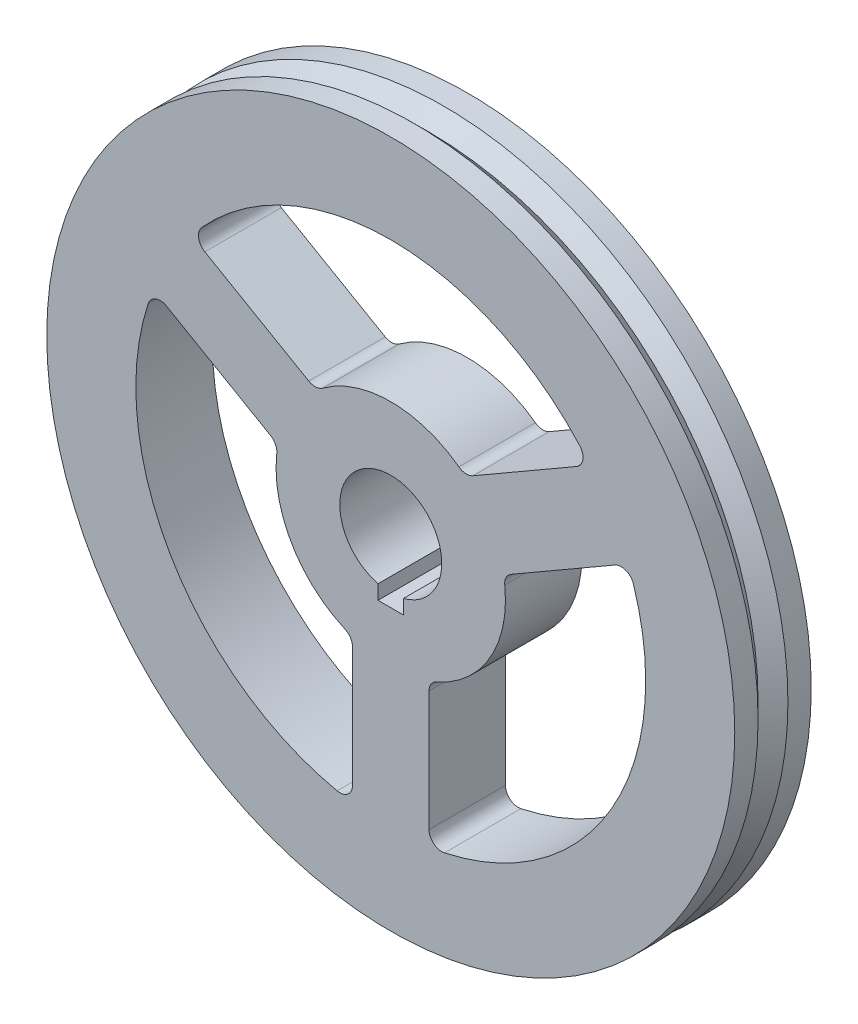
ISO-10303-21;
HEADER;
FILE_DESCRIPTION(('STEP AP214'),'2;1');
FILE_NAME('part.step','',(''),(''),'','','');
FILE_SCHEMA(('AUTOMOTIVE_DESIGN { 1 0 10303 214 1 1 1 1 }'));
ENDSEC;
DATA;
#1=APPLICATION_CONTEXT('core data for automotive mechanical design processes');
#2=APPLICATION_PROTOCOL_DEFINITION('international standard','automotive_design',2000,#1);
#3=PRODUCT_CONTEXT('',#1,'mechanical');
#4=PRODUCT('Part','Part','',(#3));
#5=PRODUCT_RELATED_PRODUCT_CATEGORY('part','',(#4));
#6=PRODUCT_DEFINITION_FORMATION('','',#4);
#7=PRODUCT_DEFINITION_CONTEXT('part definition',#1,'design');
#8=PRODUCT_DEFINITION('design','',#6,#7);
#9=PRODUCT_DEFINITION_SHAPE('','',#8);
#10=(LENGTH_UNIT() NAMED_UNIT(*) SI_UNIT(.MILLI.,.METRE.));
#11=(NAMED_UNIT(*) PLANE_ANGLE_UNIT() SI_UNIT($,.RADIAN.));
#12=(NAMED_UNIT(*) SI_UNIT($,.STERADIAN.) SOLID_ANGLE_UNIT());
#13=UNCERTAINTY_MEASURE_WITH_UNIT(LENGTH_MEASURE(1.E-05),#10,'distance_accuracy_value','');
#14=(GEOMETRIC_REPRESENTATION_CONTEXT(3) GLOBAL_UNCERTAINTY_ASSIGNED_CONTEXT((#13)) GLOBAL_UNIT_ASSIGNED_CONTEXT((#10,
#11,#12)) REPRESENTATION_CONTEXT('',''));
#15=CARTESIAN_POINT('',(0.,0.,0.));
#16=DIRECTION('',(0.,0.,1.));
#17=DIRECTION('',(1.,0.,0.));
#18=AXIS2_PLACEMENT_3D('',#15,#16,#17);
#19=CARTESIAN_POINT('',(0.,0.,30.));
#20=DIRECTION('',(0.,0.,1.));
#21=DIRECTION('',(1.,0.,0.));
#22=AXIS2_PLACEMENT_3D('',#19,#20,#21);
#23=PLANE('',#22);
#24=CARTESIAN_POINT('',(0.,0.,30.));
#25=DIRECTION('',(0.,0.,-1.));
#26=DIRECTION('',(-1.,0.,0.));
#27=AXIS2_PLACEMENT_3D('',#24,#25,#26);
#28=CIRCLE('',#27,134.946096873368);
#29=CARTESIAN_POINT('',(-134.946096873368,0.,30.));
#30=VERTEX_POINT('',#29);
#31=EDGE_CURVE('E436',#30,#30,#28,.T.);
#32=ORIENTED_EDGE('',*,*,#31,.F.);
#33=EDGE_LOOP('',(#32));
#34=FACE_BOUND('',#33,.T.);
#35=CARTESIAN_POINT('',(90.4285397107273,29.1149309768272,30.));
#36=DIRECTION('',(0.,0.,1.));
#37=DIRECTION('',(1.,0.,0.));
#38=AXIS2_PLACEMENT_3D('',#35,#36,#37);
#39=CIRCLE('',#38,5.);
#40=CARTESIAN_POINT('',(95.1879365376077,30.6472957650813,30.));
#41=VERTEX_POINT('',#40);
#42=CARTESIAN_POINT('',(87.9285397107274,33.4450579957494,30.));
#43=VERTEX_POINT('',#42);
#44=EDGE_CURVE('E257',#41,#43,#39,.T.);
#45=ORIENTED_EDGE('',*,*,#44,.F.);
#46=CARTESIAN_POINT('',(0.,0.,30.));
#47=DIRECTION('',(0.,0.,1.));
#48=DIRECTION('',(1.,0.,0.));
#49=AXIS2_PLACEMENT_3D('',#46,#47,#48);
#50=CIRCLE('',#49,100.);
#51=CARTESIAN_POINT('',(21.0526315789474,-97.7588190579301,30.));
#52=VERTEX_POINT('',#51);
#53=EDGE_CURVE('E255',#52,#41,#50,.T.);
#54=ORIENTED_EDGE('',*,*,#53,.F.);
#55=CARTESIAN_POINT('',(20.,-92.8708781050336,30.));
#56=DIRECTION('',(0.,0.,1.));
#57=DIRECTION('',(-1.,0.,0.));
#58=AXIS2_PLACEMENT_3D('',#55,#56,#57);
#59=CIRCLE('',#58,5.00000000000001);
#60=CARTESIAN_POINT('',(15.,-92.8708781050336,30.));
#61=VERTEX_POINT('',#60);
#62=EDGE_CURVE('E270',#61,#52,#59,.T.);
#63=ORIENTED_EDGE('',*,*,#62,.F.);
#64=DIRECTION('',(0.,-1.,0.));
#65=VECTOR('',#64,1.);
#66=CARTESIAN_POINT('',(15.,-45.8257569495584,30.));
#67=LINE('',#66,#65);
#68=CARTESIAN_POINT('',(15.,-45.8257569495584,30.));
#69=VERTEX_POINT('',#68);
#70=EDGE_CURVE('E268',#69,#61,#67,.T.);
#71=ORIENTED_EDGE('',*,*,#70,.F.);
#72=CARTESIAN_POINT('',(20.,-45.8257569495584,30.));
#73=DIRECTION('',(0.,0.,1.));
#74=DIRECTION('',(1.,0.,0.));
#75=AXIS2_PLACEMENT_3D('',#72,#73,#74);
#76=CIRCLE('',#75,4.99999999999999);
#77=CARTESIAN_POINT('',(18.,-41.2431812546026,30.));
#78=VERTEX_POINT('',#77);
#79=EDGE_CURVE('E266',#78,#69,#76,.T.);
#80=ORIENTED_EDGE('',*,*,#79,.F.);
#81=CARTESIAN_POINT('',(0.,0.,30.));
#82=DIRECTION('',(0.,0.,-1.));
#83=DIRECTION('',(1.,0.,0.));
#84=AXIS2_PLACEMENT_3D('',#81,#82,#83);
#85=CIRCLE('',#84,45.);
#86=CARTESIAN_POINT('',(44.717642699372,5.03313335918101,30.));
#87=VERTEX_POINT('',#86);
#88=EDGE_CURVE('E264',#87,#78,#85,.T.);
#89=ORIENTED_EDGE('',*,*,#88,.F.);
#90=CARTESIAN_POINT('',(49.6862696659689,5.59237039908999,30.));
#91=DIRECTION('',(0.,0.,1.));
#92=DIRECTION('',(-1.,0.,0.));
#93=AXIS2_PLACEMENT_3D('',#90,#91,#92);
#94=CIRCLE('',#93,4.99999999999999);
#95=CARTESIAN_POINT('',(47.1862696659689,9.9224974180122,30.));
#96=VERTEX_POINT('',#95);
#97=EDGE_CURVE('E262',#96,#87,#94,.T.);
#98=ORIENTED_EDGE('',*,*,#97,.F.);
#99=DIRECTION('',(-0.866025403784443,-0.499999999999992,0.));
#100=VECTOR('',#99,1.);
#101=CARTESIAN_POINT('',(47.1862696659689,9.9224974180122,30.));
#102=LINE('',#101,#100);
#103=EDGE_CURVE('E260',#43,#96,#102,.T.);
#104=ORIENTED_EDGE('',*,*,#103,.F.);
#105=EDGE_LOOP('',(#45,#54,#63,#71,#80,#89,#98,#104));
#106=FACE_BOUND('',#105,.T.);
#107=CARTESIAN_POINT('',(0.,0.,30.));
#108=DIRECTION('',(0.,0.,-1.));
#109=DIRECTION('',(1.,0.,0.));
#110=AXIS2_PLACEMENT_3D('',#107,#108,#109);
#111=CIRCLE('',#110,45.);
#112=CARTESIAN_POINT('',(-26.7176426993719,36.2100478954213,30.));
#113=VERTEX_POINT('',#112);
#114=CARTESIAN_POINT('',(26.7176426993723,36.2100478954209,30.));
#115=VERTEX_POINT('',#114);
#116=EDGE_CURVE('E314',#113,#115,#111,.T.);
#117=ORIENTED_EDGE('',*,*,#116,.F.);
#118=CARTESIAN_POINT('',(-29.6862696659687,40.2333865504681,30.));
#119=DIRECTION('',(0.,0.,1.));
#120=DIRECTION('',(-1.,0.,0.));
#121=AXIS2_PLACEMENT_3D('',#118,#119,#120);
#122=CIRCLE('',#121,4.99999999999999);
#123=CARTESIAN_POINT('',(-32.1862696659687,35.9032595315459,30.));
#124=VERTEX_POINT('',#123);
#125=EDGE_CURVE('E312',#124,#113,#122,.T.);
#126=ORIENTED_EDGE('',*,*,#125,.F.);
#127=DIRECTION('',(0.866025403784436,-0.500000000000004,0.));
#128=VECTOR('',#127,1.);
#129=CARTESIAN_POINT('',(-32.1862696659687,35.9032595315459,30.));
#130=LINE('',#129,#128);
#131=CARTESIAN_POINT('',(-72.9285397107268,59.4258201092837,30.));
#132=VERTEX_POINT('',#131);
#133=EDGE_CURVE('E328',#132,#124,#130,.T.);
#134=ORIENTED_EDGE('',*,*,#133,.F.);
#135=CARTESIAN_POINT('',(-70.4285397107268,63.7559471282059,30.));
#136=DIRECTION('',(0.,0.,1.));
#137=DIRECTION('',(1.,0.,0.));
#138=AXIS2_PLACEMENT_3D('',#135,#136,#137);
#139=CIRCLE('',#138,5.00000000000001);
#140=CARTESIAN_POINT('',(-74.1353049586598,67.1115232928483,30.));
#141=VERTEX_POINT('',#140);
#142=EDGE_CURVE('E325',#141,#132,#139,.T.);
#143=ORIENTED_EDGE('',*,*,#142,.F.);
#144=CARTESIAN_POINT('',(0.,0.,30.));
#145=DIRECTION('',(0.,0.,1.));
#146=DIRECTION('',(1.,0.,0.));
#147=AXIS2_PLACEMENT_3D('',#144,#145,#146);
#148=CIRCLE('',#147,100.);
#149=CARTESIAN_POINT('',(74.1353049586607,67.1115232928473,30.));
#150=VERTEX_POINT('',#149);
#151=EDGE_CURVE('E323',#150,#141,#148,.T.);
#152=ORIENTED_EDGE('',*,*,#151,.F.);
#153=CARTESIAN_POINT('',(70.4285397107277,63.7559471282049,30.));
#154=DIRECTION('',(0.,0.,1.));
#155=DIRECTION('',(-1.,0.,0.));
#156=AXIS2_PLACEMENT_3D('',#153,#154,#155);
#157=CIRCLE('',#156,5.);
#158=CARTESIAN_POINT('',(72.9285397107276,59.4258201092827,30.));
#159=VERTEX_POINT('',#158);
#160=EDGE_CURVE('E321',#159,#150,#157,.T.);
#161=ORIENTED_EDGE('',*,*,#160,.F.);
#162=DIRECTION('',(0.866025403784443,0.499999999999992,0.));
#163=VECTOR('',#162,1.);
#164=CARTESIAN_POINT('',(32.1862696659692,35.9032595315455,30.));
#165=LINE('',#164,#163);
#166=CARTESIAN_POINT('',(32.1862696659692,35.9032595315455,30.));
#167=VERTEX_POINT('',#166);
#168=EDGE_CURVE('E319',#167,#159,#165,.T.);
#169=ORIENTED_EDGE('',*,*,#168,.F.);
#170=CARTESIAN_POINT('',(29.6862696659692,40.2333865504677,30.));
#171=DIRECTION('',(0.,0.,1.));
#172=DIRECTION('',(1.,0.,0.));
#173=AXIS2_PLACEMENT_3D('',#170,#171,#172);
#174=CIRCLE('',#173,4.99999999999999);
#175=EDGE_CURVE('E317',#115,#167,#174,.T.);
#176=ORIENTED_EDGE('',*,*,#175,.F.);
#177=EDGE_LOOP('',(#117,#126,#134,#143,#152,#161,#169,#176));
#178=FACE_BOUND('',#177,.T.);
#179=CARTESIAN_POINT('',(0.,0.,30.));
#180=DIRECTION('',(0.,0.,-1.));
#181=DIRECTION('',(1.,0.,0.));
#182=AXIS2_PLACEMENT_3D('',#179,#180,#181);
#183=CIRCLE('',#182,45.);
#184=CARTESIAN_POINT('',(-18.,-41.2431812546026,30.));
#185=VERTEX_POINT('',#184);
#186=CARTESIAN_POINT('',(-44.717642699372,5.03313335918157,30.));
#187=VERTEX_POINT('',#186);
#188=EDGE_CURVE('E373',#185,#187,#183,.T.);
#189=ORIENTED_EDGE('',*,*,#188,.F.);
#190=CARTESIAN_POINT('',(-20.,-45.8257569495584,30.));
#191=DIRECTION('',(0.,0.,1.));
#192=DIRECTION('',(-1.,0.,0.));
#193=AXIS2_PLACEMENT_3D('',#190,#191,#192);
#194=CIRCLE('',#193,4.99999999999999);
#195=CARTESIAN_POINT('',(-15.,-45.8257569495584,30.));
#196=VERTEX_POINT('',#195);
#197=EDGE_CURVE('E371',#196,#185,#194,.T.);
#198=ORIENTED_EDGE('',*,*,#197,.F.);
#199=DIRECTION('',(0.,1.,0.));
#200=VECTOR('',#199,1.);
#201=CARTESIAN_POINT('',(-15.,-45.8257569495584,30.));
#202=LINE('',#201,#200);
#203=CARTESIAN_POINT('',(-15.,-92.8708781050336,30.));
#204=VERTEX_POINT('',#203);
#205=EDGE_CURVE('E387',#204,#196,#202,.T.);
#206=ORIENTED_EDGE('',*,*,#205,.F.);
#207=CARTESIAN_POINT('',(-20.,-92.8708781050336,30.));
#208=DIRECTION('',(0.,0.,1.));
#209=DIRECTION('',(1.,0.,0.));
#210=AXIS2_PLACEMENT_3D('',#207,#208,#209);
#211=CIRCLE('',#210,5.00000000000001);
#212=CARTESIAN_POINT('',(-21.0526315789473,-97.7588190579301,30.));
#213=VERTEX_POINT('',#212);
#214=EDGE_CURVE('E384',#213,#204,#211,.T.);
#215=ORIENTED_EDGE('',*,*,#214,.F.);
#216=CARTESIAN_POINT('',(0.,0.,30.));
#217=DIRECTION('',(0.,0.,1.));
#218=DIRECTION('',(1.,0.,0.));
#219=AXIS2_PLACEMENT_3D('',#216,#217,#218);
#220=CIRCLE('',#219,100.);
#221=CARTESIAN_POINT('',(-95.1879365376073,30.6472957650825,30.));
#222=VERTEX_POINT('',#221);
#223=EDGE_CURVE('E382',#222,#213,#220,.T.);
#224=ORIENTED_EDGE('',*,*,#223,.F.);
#225=CARTESIAN_POINT('',(-90.428539710727,29.1149309768284,30.));
#226=DIRECTION('',(0.,0.,1.));
#227=DIRECTION('',(-1.,0.,0.));
#228=AXIS2_PLACEMENT_3D('',#225,#226,#227);
#229=CIRCLE('',#228,5.00000000000002);
#230=CARTESIAN_POINT('',(-87.9285397107269,33.4450579957506,30.));
#231=VERTEX_POINT('',#230);
#232=EDGE_CURVE('E380',#231,#222,#229,.T.);
#233=ORIENTED_EDGE('',*,*,#232,.F.);
#234=DIRECTION('',(-0.866025403784436,0.500000000000004,0.));
#235=VECTOR('',#234,1.);
#236=CARTESIAN_POINT('',(-47.1862696659688,9.92249741801282,30.));
#237=LINE('',#236,#235);
#238=CARTESIAN_POINT('',(-47.1862696659688,9.92249741801282,30.));
#239=VERTEX_POINT('',#238);
#240=EDGE_CURVE('E378',#239,#231,#237,.T.);
#241=ORIENTED_EDGE('',*,*,#240,.F.);
#242=CARTESIAN_POINT('',(-49.6862696659689,5.59237039909064,30.));
#243=DIRECTION('',(0.,0.,1.));
#244=DIRECTION('',(1.,0.,0.));
#245=AXIS2_PLACEMENT_3D('',#242,#243,#244);
#246=CIRCLE('',#245,4.99999999999999);
#247=EDGE_CURVE('E376',#187,#239,#246,.T.);
#248=ORIENTED_EDGE('',*,*,#247,.F.);
#249=EDGE_LOOP('',(#189,#198,#206,#215,#224,#233,#241,#248));
#250=FACE_BOUND('',#249,.T.);
#251=DIRECTION('',(0.,1.,0.));
#252=VECTOR('',#251,1.);
#253=CARTESIAN_POINT('',(5.,-15.,30.));
#254=LINE('',#253,#252);
#255=CARTESIAN_POINT('',(5.,-25.,30.));
#256=VERTEX_POINT('',#255);
#257=CARTESIAN_POINT('',(5.,-19.3649167310371,30.));
#258=VERTEX_POINT('',#257);
#259=EDGE_CURVE('E222',#256,#258,#254,.T.);
#260=ORIENTED_EDGE('',*,*,#259,.F.);
#261=DIRECTION('',(1.,0.,0.));
#262=VECTOR('',#261,1.);
#263=CARTESIAN_POINT('',(-5.,-25.,30.));
#264=LINE('',#263,#262);
#265=CARTESIAN_POINT('',(-5.,-25.,30.));
#266=VERTEX_POINT('',#265);
#267=EDGE_CURVE('E245',#266,#256,#264,.T.);
#268=ORIENTED_EDGE('',*,*,#267,.F.);
#269=DIRECTION('',(0.,-1.,0.));
#270=VECTOR('',#269,1.);
#271=CARTESIAN_POINT('',(-5.,-15.,30.));
#272=LINE('',#271,#270);
#273=CARTESIAN_POINT('',(-5.,-19.3649167310371,30.));
#274=VERTEX_POINT('',#273);
#275=EDGE_CURVE('E233',#274,#266,#272,.T.);
#276=ORIENTED_EDGE('',*,*,#275,.F.);
#277=CARTESIAN_POINT('',(0.,0.,30.));
#278=DIRECTION('',(0.,0.,1.));
#279=DIRECTION('',(1.,0.,0.));
#280=AXIS2_PLACEMENT_3D('',#277,#278,#279);
#281=CIRCLE('',#280,20.);
#282=EDGE_CURVE('E11',#258,#274,#281,.T.);
#283=ORIENTED_EDGE('',*,*,#282,.F.);
#284=EDGE_LOOP('',(#260,#268,#276,#283));
#285=FACE_BOUND('',#284,.T.);
#286=ADVANCED_FACE('F37',(#34,#106,#178,#250,#285),#23,.T.);
#287=CARTESIAN_POINT('',(0.,0.,0.));
#288=DIRECTION('',(0.,0.,1.));
#289=DIRECTION('',(1.,0.,0.));
#290=AXIS2_PLACEMENT_3D('',#287,#288,#289);
#291=PLANE('',#290);
#292=CARTESIAN_POINT('',(0.,0.,0.));
#293=DIRECTION('',(0.,0.,-1.));
#294=DIRECTION('',(-1.,0.,0.));
#295=AXIS2_PLACEMENT_3D('',#292,#293,#294);
#296=CIRCLE('',#295,134.946096873368);
#297=CARTESIAN_POINT('',(-134.946096873368,0.,0.));
#298=VERTEX_POINT('',#297);
#299=EDGE_CURVE('E439',#298,#298,#296,.T.);
#300=ORIENTED_EDGE('',*,*,#299,.T.);
#301=EDGE_LOOP('',(#300));
#302=FACE_BOUND('',#301,.T.);
#303=CARTESIAN_POINT('',(0.,0.,0.));
#304=DIRECTION('',(0.,0.,1.));
#305=DIRECTION('',(1.,0.,0.));
#306=AXIS2_PLACEMENT_3D('',#303,#304,#305);
#307=CIRCLE('',#306,100.);
#308=CARTESIAN_POINT('',(21.0526315789474,-97.7588190579301,0.));
#309=VERTEX_POINT('',#308);
#310=CARTESIAN_POINT('',(95.1879365376077,30.6472957650813,0.));
#311=VERTEX_POINT('',#310);
#312=EDGE_CURVE('E254',#309,#311,#307,.T.);
#313=ORIENTED_EDGE('',*,*,#312,.T.);
#314=CARTESIAN_POINT('',(90.4285397107273,29.1149309768272,0.));
#315=DIRECTION('',(0.,0.,1.));
#316=DIRECTION('',(1.,0.,0.));
#317=AXIS2_PLACEMENT_3D('',#314,#315,#316);
#318=CIRCLE('',#317,5.);
#319=CARTESIAN_POINT('',(87.9285397107274,33.4450579957494,0.));
#320=VERTEX_POINT('',#319);
#321=EDGE_CURVE('E275',#311,#320,#318,.T.);
#322=ORIENTED_EDGE('',*,*,#321,.T.);
#323=DIRECTION('',(-0.866025403784443,-0.499999999999992,0.));
#324=VECTOR('',#323,1.);
#325=CARTESIAN_POINT('',(47.1862696659689,9.9224974180122,0.));
#326=LINE('',#325,#324);
#327=CARTESIAN_POINT('',(47.1862696659689,9.9224974180122,0.));
#328=VERTEX_POINT('',#327);
#329=EDGE_CURVE('E278',#320,#328,#326,.T.);
#330=ORIENTED_EDGE('',*,*,#329,.T.);
#331=CARTESIAN_POINT('',(49.6862696659689,5.59237039908999,0.));
#332=DIRECTION('',(0.,0.,1.));
#333=DIRECTION('',(-1.,0.,0.));
#334=AXIS2_PLACEMENT_3D('',#331,#332,#333);
#335=CIRCLE('',#334,4.99999999999999);
#336=CARTESIAN_POINT('',(44.717642699372,5.03313335918101,0.));
#337=VERTEX_POINT('',#336);
#338=EDGE_CURVE('E281',#328,#337,#335,.T.);
#339=ORIENTED_EDGE('',*,*,#338,.T.);
#340=CARTESIAN_POINT('',(0.,0.,0.));
#341=DIRECTION('',(0.,0.,-1.));
#342=DIRECTION('',(1.,0.,0.));
#343=AXIS2_PLACEMENT_3D('',#340,#341,#342);
#344=CIRCLE('',#343,45.);
#345=CARTESIAN_POINT('',(18.,-41.2431812546026,0.));
#346=VERTEX_POINT('',#345);
#347=EDGE_CURVE('E284',#337,#346,#344,.T.);
#348=ORIENTED_EDGE('',*,*,#347,.T.);
#349=CARTESIAN_POINT('',(20.,-45.8257569495584,0.));
#350=DIRECTION('',(0.,0.,1.));
#351=DIRECTION('',(1.,0.,0.));
#352=AXIS2_PLACEMENT_3D('',#349,#350,#351);
#353=CIRCLE('',#352,4.99999999999999);
#354=CARTESIAN_POINT('',(15.,-45.8257569495584,0.));
#355=VERTEX_POINT('',#354);
#356=EDGE_CURVE('E287',#346,#355,#353,.T.);
#357=ORIENTED_EDGE('',*,*,#356,.T.);
#358=DIRECTION('',(0.,-1.,0.));
#359=VECTOR('',#358,1.);
#360=CARTESIAN_POINT('',(15.,-45.8257569495584,0.));
#361=LINE('',#360,#359);
#362=CARTESIAN_POINT('',(15.,-92.8708781050336,0.));
#363=VERTEX_POINT('',#362);
#364=EDGE_CURVE('E290',#355,#363,#361,.T.);
#365=ORIENTED_EDGE('',*,*,#364,.T.);
#366=CARTESIAN_POINT('',(20.,-92.8708781050336,0.));
#367=DIRECTION('',(0.,0.,1.));
#368=DIRECTION('',(-1.,0.,0.));
#369=AXIS2_PLACEMENT_3D('',#366,#367,#368);
#370=CIRCLE('',#369,5.00000000000001);
#371=EDGE_CURVE('E258',#363,#309,#370,.T.);
#372=ORIENTED_EDGE('',*,*,#371,.T.);
#373=EDGE_LOOP('',(#313,#322,#330,#339,#348,#357,#365,#372));
#374=FACE_BOUND('',#373,.T.);
#375=CARTESIAN_POINT('',(-20.,-45.8257569495584,0.));
#376=DIRECTION('',(0.,0.,1.));
#377=DIRECTION('',(-1.,0.,0.));
#378=AXIS2_PLACEMENT_3D('',#375,#376,#377);
#379=CIRCLE('',#378,4.99999999999999);
#380=CARTESIAN_POINT('',(-15.,-45.8257569495584,0.));
#381=VERTEX_POINT('',#380);
#382=CARTESIAN_POINT('',(-18.,-41.2431812546026,0.));
#383=VERTEX_POINT('',#382);
#384=EDGE_CURVE('E370',#381,#383,#379,.T.);
#385=ORIENTED_EDGE('',*,*,#384,.T.);
#386=CARTESIAN_POINT('',(0.,0.,0.));
#387=DIRECTION('',(0.,0.,-1.));
#388=DIRECTION('',(1.,0.,0.));
#389=AXIS2_PLACEMENT_3D('',#386,#387,#388);
#390=CIRCLE('',#389,45.);
#391=CARTESIAN_POINT('',(-44.717642699372,5.03313335918157,0.));
#392=VERTEX_POINT('',#391);
#393=EDGE_CURVE('E392',#383,#392,#390,.T.);
#394=ORIENTED_EDGE('',*,*,#393,.T.);
#395=CARTESIAN_POINT('',(-49.6862696659689,5.59237039909064,0.));
#396=DIRECTION('',(0.,0.,1.));
#397=DIRECTION('',(1.,0.,0.));
#398=AXIS2_PLACEMENT_3D('',#395,#396,#397);
#399=CIRCLE('',#398,4.99999999999999);
#400=CARTESIAN_POINT('',(-47.1862696659688,9.92249741801282,0.));
#401=VERTEX_POINT('',#400);
#402=EDGE_CURVE('E395',#392,#401,#399,.T.);
#403=ORIENTED_EDGE('',*,*,#402,.T.);
#404=DIRECTION('',(-0.866025403784436,0.500000000000004,0.));
#405=VECTOR('',#404,1.);
#406=CARTESIAN_POINT('',(-47.1862696659688,9.92249741801282,0.));
#407=LINE('',#406,#405);
#408=CARTESIAN_POINT('',(-87.9285397107269,33.4450579957506,0.));
#409=VERTEX_POINT('',#408);
#410=EDGE_CURVE('E398',#401,#409,#407,.T.);
#411=ORIENTED_EDGE('',*,*,#410,.T.);
#412=CARTESIAN_POINT('',(-90.428539710727,29.1149309768284,0.));
#413=DIRECTION('',(0.,0.,1.));
#414=DIRECTION('',(-1.,0.,0.));
#415=AXIS2_PLACEMENT_3D('',#412,#413,#414);
#416=CIRCLE('',#415,5.00000000000002);
#417=CARTESIAN_POINT('',(-95.1879365376073,30.6472957650825,0.));
#418=VERTEX_POINT('',#417);
#419=EDGE_CURVE('E401',#409,#418,#416,.T.);
#420=ORIENTED_EDGE('',*,*,#419,.T.);
#421=CARTESIAN_POINT('',(0.,0.,0.));
#422=DIRECTION('',(0.,0.,1.));
#423=DIRECTION('',(1.,0.,0.));
#424=AXIS2_PLACEMENT_3D('',#421,#422,#423);
#425=CIRCLE('',#424,100.);
#426=CARTESIAN_POINT('',(-21.0526315789473,-97.7588190579301,0.));
#427=VERTEX_POINT('',#426);
#428=EDGE_CURVE('E404',#418,#427,#425,.T.);
#429=ORIENTED_EDGE('',*,*,#428,.T.);
#430=CARTESIAN_POINT('',(-20.,-92.8708781050336,0.));
#431=DIRECTION('',(0.,0.,1.));
#432=DIRECTION('',(1.,0.,0.));
#433=AXIS2_PLACEMENT_3D('',#430,#431,#432);
#434=CIRCLE('',#433,5.00000000000001);
#435=CARTESIAN_POINT('',(-15.,-92.8708781050336,0.));
#436=VERTEX_POINT('',#435);
#437=EDGE_CURVE('E407',#427,#436,#434,.T.);
#438=ORIENTED_EDGE('',*,*,#437,.T.);
#439=DIRECTION('',(0.,1.,0.));
#440=VECTOR('',#439,1.);
#441=CARTESIAN_POINT('',(-15.,-45.8257569495584,0.));
#442=LINE('',#441,#440);
#443=EDGE_CURVE('E374',#436,#381,#442,.T.);
#444=ORIENTED_EDGE('',*,*,#443,.T.);
#445=EDGE_LOOP('',(#385,#394,#403,#411,#420,#429,#438,#444));
#446=FACE_BOUND('',#445,.T.);
#447=DIRECTION('',(-1.,0.,0.));
#448=VECTOR('',#447,1.);
#449=CARTESIAN_POINT('',(-5.,-25.,0.));
#450=LINE('',#449,#448);
#451=CARTESIAN_POINT('',(5.,-25.,0.));
#452=VERTEX_POINT('',#451);
#453=CARTESIAN_POINT('',(-5.,-25.,0.));
#454=VERTEX_POINT('',#453);
#455=EDGE_CURVE('E240',#452,#454,#450,.T.);
#456=ORIENTED_EDGE('',*,*,#455,.F.);
#457=DIRECTION('',(0.,-1.,0.));
#458=VECTOR('',#457,1.);
#459=CARTESIAN_POINT('',(5.,-15.,0.));
#460=LINE('',#459,#458);
#461=CARTESIAN_POINT('',(5.,-19.3649167310371,0.));
#462=VERTEX_POINT('',#461);
#463=EDGE_CURVE('E234',#462,#452,#460,.T.);
#464=ORIENTED_EDGE('',*,*,#463,.F.);
#465=CARTESIAN_POINT('',(0.,0.,0.));
#466=DIRECTION('',(0.,0.,1.));
#467=DIRECTION('',(1.,0.,0.));
#468=AXIS2_PLACEMENT_3D('',#465,#466,#467);
#469=CIRCLE('',#468,20.);
#470=CARTESIAN_POINT('',(-5.,-19.3649167310371,0.));
#471=VERTEX_POINT('',#470);
#472=EDGE_CURVE('E41',#462,#471,#469,.T.);
#473=ORIENTED_EDGE('',*,*,#472,.T.);
#474=DIRECTION('',(0.,1.,0.));
#475=VECTOR('',#474,1.);
#476=CARTESIAN_POINT('',(-5.,-15.,0.));
#477=LINE('',#476,#475);
#478=EDGE_CURVE('E52',#454,#471,#477,.T.);
#479=ORIENTED_EDGE('',*,*,#478,.F.);
#480=EDGE_LOOP('',(#456,#464,#473,#479));
#481=FACE_BOUND('',#480,.T.);
#482=CARTESIAN_POINT('',(-29.6862696659687,40.2333865504681,0.));
#483=DIRECTION('',(0.,0.,1.));
#484=DIRECTION('',(-1.,0.,0.));
#485=AXIS2_PLACEMENT_3D('',#482,#483,#484);
#486=CIRCLE('',#485,4.99999999999999);
#487=CARTESIAN_POINT('',(-32.1862696659687,35.9032595315459,0.));
#488=VERTEX_POINT('',#487);
#489=CARTESIAN_POINT('',(-26.7176426993719,36.2100478954213,0.));
#490=VERTEX_POINT('',#489);
#491=EDGE_CURVE('E311',#488,#490,#486,.T.);
#492=ORIENTED_EDGE('',*,*,#491,.T.);
#493=CARTESIAN_POINT('',(0.,0.,0.));
#494=DIRECTION('',(0.,0.,-1.));
#495=DIRECTION('',(1.,0.,0.));
#496=AXIS2_PLACEMENT_3D('',#493,#494,#495);
#497=CIRCLE('',#496,45.);
#498=CARTESIAN_POINT('',(26.7176426993723,36.2100478954209,0.));
#499=VERTEX_POINT('',#498);
#500=EDGE_CURVE('E333',#490,#499,#497,.T.);
#501=ORIENTED_EDGE('',*,*,#500,.T.);
#502=CARTESIAN_POINT('',(29.6862696659692,40.2333865504677,0.));
#503=DIRECTION('',(0.,0.,1.));
#504=DIRECTION('',(1.,0.,0.));
#505=AXIS2_PLACEMENT_3D('',#502,#503,#504);
#506=CIRCLE('',#505,4.99999999999999);
#507=CARTESIAN_POINT('',(32.1862696659692,35.9032595315455,0.));
#508=VERTEX_POINT('',#507);
#509=EDGE_CURVE('E336',#499,#508,#506,.T.);
#510=ORIENTED_EDGE('',*,*,#509,.T.);
#511=DIRECTION('',(0.866025403784443,0.499999999999992,0.));
#512=VECTOR('',#511,1.);
#513=CARTESIAN_POINT('',(32.1862696659692,35.9032595315455,0.));
#514=LINE('',#513,#512);
#515=CARTESIAN_POINT('',(72.9285397107276,59.4258201092827,0.));
#516=VERTEX_POINT('',#515);
#517=EDGE_CURVE('E339',#508,#516,#514,.T.);
#518=ORIENTED_EDGE('',*,*,#517,.T.);
#519=CARTESIAN_POINT('',(70.4285397107277,63.7559471282049,0.));
#520=DIRECTION('',(0.,0.,1.));
#521=DIRECTION('',(-1.,0.,0.));
#522=AXIS2_PLACEMENT_3D('',#519,#520,#521);
#523=CIRCLE('',#522,5.);
#524=CARTESIAN_POINT('',(74.1353049586607,67.1115232928473,0.));
#525=VERTEX_POINT('',#524);
#526=EDGE_CURVE('E342',#516,#525,#523,.T.);
#527=ORIENTED_EDGE('',*,*,#526,.T.);
#528=CARTESIAN_POINT('',(0.,0.,0.));
#529=DIRECTION('',(0.,0.,1.));
#530=DIRECTION('',(1.,0.,0.));
#531=AXIS2_PLACEMENT_3D('',#528,#529,#530);
#532=CIRCLE('',#531,100.);
#533=CARTESIAN_POINT('',(-74.1353049586598,67.1115232928483,0.));
#534=VERTEX_POINT('',#533);
#535=EDGE_CURVE('E345',#525,#534,#532,.T.);
#536=ORIENTED_EDGE('',*,*,#535,.T.);
#537=CARTESIAN_POINT('',(-70.4285397107268,63.7559471282059,0.));
#538=DIRECTION('',(0.,0.,1.));
#539=DIRECTION('',(1.,0.,0.));
#540=AXIS2_PLACEMENT_3D('',#537,#538,#539);
#541=CIRCLE('',#540,5.00000000000001);
#542=CARTESIAN_POINT('',(-72.9285397107268,59.4258201092837,0.));
#543=VERTEX_POINT('',#542);
#544=EDGE_CURVE('E348',#534,#543,#541,.T.);
#545=ORIENTED_EDGE('',*,*,#544,.T.);
#546=DIRECTION('',(0.866025403784436,-0.500000000000004,0.));
#547=VECTOR('',#546,1.);
#548=CARTESIAN_POINT('',(-32.1862696659687,35.9032595315459,0.));
#549=LINE('',#548,#547);
#550=EDGE_CURVE('E315',#543,#488,#549,.T.);
#551=ORIENTED_EDGE('',*,*,#550,.T.);
#552=EDGE_LOOP('',(#492,#501,#510,#518,#527,#536,#545,#551));
#553=FACE_BOUND('',#552,.T.);
#554=ADVANCED_FACE('F39',(#302,#374,#446,#481,#553),#291,.F.);
#555=CARTESIAN_POINT('',(0.,0.,30.));
#556=DIRECTION('',(0.,0.,-1.));
#557=DIRECTION('',(-1.,0.,0.));
#558=AXIS2_PLACEMENT_3D('',#555,#556,#557);
#559=CYLINDRICAL_SURFACE('',#558,20.);
#560=DIRECTION('',(0.,0.,-1.));
#561=VECTOR('',#560,1.);
#562=CARTESIAN_POINT('',(5.,-19.3649167310371,30.));
#563=LINE('',#562,#561);
#564=EDGE_CURVE('E225',#462,#258,#563,.F.);
#565=ORIENTED_EDGE('',*,*,#564,.T.);
#566=ORIENTED_EDGE('',*,*,#282,.T.);
#567=DIRECTION('',(0.,0.,-1.));
#568=VECTOR('',#567,1.);
#569=CARTESIAN_POINT('',(-5.,-19.3649167310371,30.));
#570=LINE('',#569,#568);
#571=EDGE_CURVE('E241',#274,#471,#570,.T.);
#572=ORIENTED_EDGE('',*,*,#571,.T.);
#573=ORIENTED_EDGE('',*,*,#472,.F.);
#574=EDGE_LOOP('',(#565,#566,#572,#573));
#575=FACE_BOUND('',#574,.T.);
#576=ADVANCED_FACE('F238',(#575),#559,.F.);
#577=CARTESIAN_POINT('',(-20.,-45.8257569495584,30.));
#578=DIRECTION('',(0.,0.,-1.));
#579=DIRECTION('',(-1.,0.,0.));
#580=AXIS2_PLACEMENT_3D('',#577,#578,#579);
#581=CYLINDRICAL_SURFACE('',#580,4.99999999999999);
#582=ORIENTED_EDGE('',*,*,#384,.F.);
#583=DIRECTION('',(0.,0.,-1.));
#584=VECTOR('',#583,1.);
#585=CARTESIAN_POINT('',(-15.,-45.8257569495584,30.));
#586=LINE('',#585,#584);
#587=EDGE_CURVE('E389',#196,#381,#586,.T.);
#588=ORIENTED_EDGE('',*,*,#587,.F.);
#589=ORIENTED_EDGE('',*,*,#197,.T.);
#590=DIRECTION('',(0.,0.,-1.));
#591=VECTOR('',#590,1.);
#592=CARTESIAN_POINT('',(-18.,-41.2431812546026,30.));
#593=LINE('',#592,#591);
#594=EDGE_CURVE('E426',#185,#383,#593,.T.);
#595=ORIENTED_EDGE('',*,*,#594,.T.);
#596=EDGE_LOOP('',(#582,#588,#589,#595));
#597=FACE_BOUND('',#596,.T.);
#598=ADVANCED_FACE('F482',(#597),#581,.F.);
#599=CARTESIAN_POINT('',(0.,0.,30.));
#600=DIRECTION('',(0.,0.,-1.));
#601=DIRECTION('',(-1.,0.,0.));
#602=AXIS2_PLACEMENT_3D('',#599,#600,#601);
#603=CYLINDRICAL_SURFACE('',#602,45.);
#604=ORIENTED_EDGE('',*,*,#393,.F.);
#605=ORIENTED_EDGE('',*,*,#594,.F.);
#606=ORIENTED_EDGE('',*,*,#188,.T.);
#607=DIRECTION('',(0.,0.,-1.));
#608=VECTOR('',#607,1.);
#609=CARTESIAN_POINT('',(-44.717642699372,5.03313335918157,30.));
#610=LINE('',#609,#608);
#611=EDGE_CURVE('E424',#187,#392,#610,.T.);
#612=ORIENTED_EDGE('',*,*,#611,.T.);
#613=EDGE_LOOP('',(#604,#605,#606,#612));
#614=FACE_BOUND('',#613,.T.);
#615=ADVANCED_FACE('F485',(#614),#603,.T.);
#616=CARTESIAN_POINT('',(-49.6862696659689,5.59237039909064,30.));
#617=DIRECTION('',(0.,0.,-1.));
#618=DIRECTION('',(-1.,0.,0.));
#619=AXIS2_PLACEMENT_3D('',#616,#617,#618);
#620=CYLINDRICAL_SURFACE('',#619,4.99999999999999);
#621=ORIENTED_EDGE('',*,*,#402,.F.);
#622=ORIENTED_EDGE('',*,*,#611,.F.);
#623=ORIENTED_EDGE('',*,*,#247,.T.);
#624=DIRECTION('',(0.,0.,-1.));
#625=VECTOR('',#624,1.);
#626=CARTESIAN_POINT('',(-47.1862696659688,9.92249741801282,30.));
#627=LINE('',#626,#625);
#628=EDGE_CURVE('E422',#239,#401,#627,.T.);
#629=ORIENTED_EDGE('',*,*,#628,.T.);
#630=EDGE_LOOP('',(#621,#622,#623,#629));
#631=FACE_BOUND('',#630,.T.);
#632=ADVANCED_FACE('F488',(#631),#620,.F.);
#633=CARTESIAN_POINT('',(-47.1862696659688,9.92249741801282,30.));
#634=DIRECTION('',(-0.500000000000004,-0.866025403784436,0.));
#635=DIRECTION('',(0.866025403784436,-0.500000000000004,0.));
#636=AXIS2_PLACEMENT_3D('',#633,#634,#635);
#637=PLANE('',#636);
#638=ORIENTED_EDGE('',*,*,#410,.F.);
#639=ORIENTED_EDGE('',*,*,#628,.F.);
#640=ORIENTED_EDGE('',*,*,#240,.T.);
#641=DIRECTION('',(0.,0.,-1.));
#642=VECTOR('',#641,1.);
#643=CARTESIAN_POINT('',(-87.9285397107269,33.4450579957506,30.));
#644=LINE('',#643,#642);
#645=EDGE_CURVE('E420',#231,#409,#644,.T.);
#646=ORIENTED_EDGE('',*,*,#645,.T.);
#647=EDGE_LOOP('',(#638,#639,#640,#646));
#648=FACE_BOUND('',#647,.T.);
#649=ADVANCED_FACE('F492',(#648),#637,.T.);
#650=CARTESIAN_POINT('',(-90.428539710727,29.1149309768284,30.));
#651=DIRECTION('',(0.,0.,-1.));
#652=DIRECTION('',(-1.,0.,0.));
#653=AXIS2_PLACEMENT_3D('',#650,#651,#652);
#654=CYLINDRICAL_SURFACE('',#653,5.00000000000002);
#655=ORIENTED_EDGE('',*,*,#419,.F.);
#656=ORIENTED_EDGE('',*,*,#645,.F.);
#657=ORIENTED_EDGE('',*,*,#232,.T.);
#658=DIRECTION('',(0.,0.,-1.));
#659=VECTOR('',#658,1.);
#660=CARTESIAN_POINT('',(-95.1879365376073,30.6472957650825,30.));
#661=LINE('',#660,#659);
#662=EDGE_CURVE('E418',#222,#418,#661,.T.);
#663=ORIENTED_EDGE('',*,*,#662,.T.);
#664=EDGE_LOOP('',(#655,#656,#657,#663));
#665=FACE_BOUND('',#664,.T.);
#666=ADVANCED_FACE('F496',(#665),#654,.F.);
#667=CARTESIAN_POINT('',(0.,0.,30.));
#668=DIRECTION('',(0.,0.,-1.));
#669=DIRECTION('',(-1.,0.,0.));
#670=AXIS2_PLACEMENT_3D('',#667,#668,#669);
#671=CYLINDRICAL_SURFACE('',#670,100.);
#672=ORIENTED_EDGE('',*,*,#428,.F.);
#673=ORIENTED_EDGE('',*,*,#662,.F.);
#674=ORIENTED_EDGE('',*,*,#223,.T.);
#675=DIRECTION('',(0.,0.,-1.));
#676=VECTOR('',#675,1.);
#677=CARTESIAN_POINT('',(-21.0526315789473,-97.7588190579301,30.));
#678=LINE('',#677,#676);
#679=EDGE_CURVE('E416',#213,#427,#678,.T.);
#680=ORIENTED_EDGE('',*,*,#679,.T.);
#681=EDGE_LOOP('',(#672,#673,#674,#680));
#682=FACE_BOUND('',#681,.T.);
#683=ADVANCED_FACE('F500',(#682),#671,.F.);
#684=CARTESIAN_POINT('',(-20.,-92.8708781050336,30.));
#685=DIRECTION('',(0.,0.,-1.));
#686=DIRECTION('',(-1.,0.,0.));
#687=AXIS2_PLACEMENT_3D('',#684,#685,#686);
#688=CYLINDRICAL_SURFACE('',#687,5.00000000000001);
#689=ORIENTED_EDGE('',*,*,#437,.F.);
#690=ORIENTED_EDGE('',*,*,#679,.F.);
#691=ORIENTED_EDGE('',*,*,#214,.T.);
#692=DIRECTION('',(0.,0.,-1.));
#693=VECTOR('',#692,1.);
#694=CARTESIAN_POINT('',(-15.,-92.8708781050336,30.));
#695=LINE('',#694,#693);
#696=EDGE_CURVE('E414',#204,#436,#695,.T.);
#697=ORIENTED_EDGE('',*,*,#696,.T.);
#698=EDGE_LOOP('',(#689,#690,#691,#697));
#699=FACE_BOUND('',#698,.T.);
#700=ADVANCED_FACE('F504',(#699),#688,.F.);
#701=CARTESIAN_POINT('',(-15.,-45.8257569495584,30.));
#702=DIRECTION('',(-1.,0.,0.));
#703=DIRECTION('',(0.,-1.,0.));
#704=AXIS2_PLACEMENT_3D('',#701,#702,#703);
#705=PLANE('',#704);
#706=ORIENTED_EDGE('',*,*,#443,.F.);
#707=ORIENTED_EDGE('',*,*,#696,.F.);
#708=ORIENTED_EDGE('',*,*,#205,.T.);
#709=ORIENTED_EDGE('',*,*,#587,.T.);
#710=EDGE_LOOP('',(#706,#707,#708,#709));
#711=FACE_BOUND('',#710,.T.);
#712=ADVANCED_FACE('F508',(#711),#705,.T.);
#713=CARTESIAN_POINT('',(-29.6862696659687,40.2333865504681,30.));
#714=DIRECTION('',(0.,0.,-1.));
#715=DIRECTION('',(-1.,0.,0.));
#716=AXIS2_PLACEMENT_3D('',#713,#714,#715);
#717=CYLINDRICAL_SURFACE('',#716,4.99999999999999);
#718=ORIENTED_EDGE('',*,*,#491,.F.);
#719=DIRECTION('',(0.,0.,-1.));
#720=VECTOR('',#719,1.);
#721=CARTESIAN_POINT('',(-32.1862696659687,35.9032595315459,30.));
#722=LINE('',#721,#720);
#723=EDGE_CURVE('E330',#124,#488,#722,.T.);
#724=ORIENTED_EDGE('',*,*,#723,.F.);
#725=ORIENTED_EDGE('',*,*,#125,.T.);
#726=DIRECTION('',(0.,0.,-1.));
#727=VECTOR('',#726,1.);
#728=CARTESIAN_POINT('',(-26.7176426993719,36.2100478954213,30.));
#729=LINE('',#728,#727);
#730=EDGE_CURVE('E367',#113,#490,#729,.T.);
#731=ORIENTED_EDGE('',*,*,#730,.T.);
#732=EDGE_LOOP('',(#718,#724,#725,#731));
#733=FACE_BOUND('',#732,.T.);
#734=ADVANCED_FACE('F512',(#733),#717,.F.);
#735=CARTESIAN_POINT('',(0.,0.,30.));
#736=DIRECTION('',(0.,0.,-1.));
#737=DIRECTION('',(-1.,0.,0.));
#738=AXIS2_PLACEMENT_3D('',#735,#736,#737);
#739=CYLINDRICAL_SURFACE('',#738,45.);
#740=ORIENTED_EDGE('',*,*,#500,.F.);
#741=ORIENTED_EDGE('',*,*,#730,.F.);
#742=ORIENTED_EDGE('',*,*,#116,.T.);
#743=DIRECTION('',(0.,0.,-1.));
#744=VECTOR('',#743,1.);
#745=CARTESIAN_POINT('',(26.7176426993723,36.2100478954209,30.));
#746=LINE('',#745,#744);
#747=EDGE_CURVE('E365',#115,#499,#746,.T.);
#748=ORIENTED_EDGE('',*,*,#747,.T.);
#749=EDGE_LOOP('',(#740,#741,#742,#748));
#750=FACE_BOUND('',#749,.T.);
#751=ADVANCED_FACE('F516',(#750),#739,.T.);
#752=CARTESIAN_POINT('',(29.6862696659692,40.2333865504677,30.));
#753=DIRECTION('',(0.,0.,-1.));
#754=DIRECTION('',(-1.,0.,0.));
#755=AXIS2_PLACEMENT_3D('',#752,#753,#754);
#756=CYLINDRICAL_SURFACE('',#755,4.99999999999999);
#757=ORIENTED_EDGE('',*,*,#509,.F.);
#758=ORIENTED_EDGE('',*,*,#747,.F.);
#759=ORIENTED_EDGE('',*,*,#175,.T.);
#760=DIRECTION('',(0.,0.,-1.));
#761=VECTOR('',#760,1.);
#762=CARTESIAN_POINT('',(32.1862696659692,35.9032595315455,30.));
#763=LINE('',#762,#761);
#764=EDGE_CURVE('E363',#167,#508,#763,.T.);
#765=ORIENTED_EDGE('',*,*,#764,.T.);
#766=EDGE_LOOP('',(#757,#758,#759,#765));
#767=FACE_BOUND('',#766,.T.);
#768=ADVANCED_FACE('F520',(#767),#756,.F.);
#769=CARTESIAN_POINT('',(32.1862696659692,35.9032595315455,30.));
#770=DIRECTION('',(-0.499999999999992,0.866025403784443,0.));
#771=DIRECTION('',(-0.866025403784443,-0.499999999999992,0.));
#772=AXIS2_PLACEMENT_3D('',#769,#770,#771);
#773=PLANE('',#772);
#774=ORIENTED_EDGE('',*,*,#517,.F.);
#775=ORIENTED_EDGE('',*,*,#764,.F.);
#776=ORIENTED_EDGE('',*,*,#168,.T.);
#777=DIRECTION('',(0.,0.,-1.));
#778=VECTOR('',#777,1.);
#779=CARTESIAN_POINT('',(72.9285397107276,59.4258201092827,30.));
#780=LINE('',#779,#778);
#781=EDGE_CURVE('E361',#159,#516,#780,.T.);
#782=ORIENTED_EDGE('',*,*,#781,.T.);
#783=EDGE_LOOP('',(#774,#775,#776,#782));
#784=FACE_BOUND('',#783,.T.);
#785=ADVANCED_FACE('F524',(#784),#773,.T.);
#786=CARTESIAN_POINT('',(70.4285397107277,63.7559471282049,30.));
#787=DIRECTION('',(0.,0.,-1.));
#788=DIRECTION('',(-1.,0.,0.));
#789=AXIS2_PLACEMENT_3D('',#786,#787,#788);
#790=CYLINDRICAL_SURFACE('',#789,5.);
#791=ORIENTED_EDGE('',*,*,#526,.F.);
#792=ORIENTED_EDGE('',*,*,#781,.F.);
#793=ORIENTED_EDGE('',*,*,#160,.T.);
#794=DIRECTION('',(0.,0.,-1.));
#795=VECTOR('',#794,1.);
#796=CARTESIAN_POINT('',(74.1353049586607,67.1115232928473,30.));
#797=LINE('',#796,#795);
#798=EDGE_CURVE('E359',#150,#525,#797,.T.);
#799=ORIENTED_EDGE('',*,*,#798,.T.);
#800=EDGE_LOOP('',(#791,#792,#793,#799));
#801=FACE_BOUND('',#800,.T.);
#802=ADVANCED_FACE('F528',(#801),#790,.F.);
#803=CARTESIAN_POINT('',(0.,0.,30.));
#804=DIRECTION('',(0.,0.,-1.));
#805=DIRECTION('',(-1.,0.,0.));
#806=AXIS2_PLACEMENT_3D('',#803,#804,#805);
#807=CYLINDRICAL_SURFACE('',#806,100.);
#808=ORIENTED_EDGE('',*,*,#535,.F.);
#809=ORIENTED_EDGE('',*,*,#798,.F.);
#810=ORIENTED_EDGE('',*,*,#151,.T.);
#811=DIRECTION('',(0.,0.,-1.));
#812=VECTOR('',#811,1.);
#813=CARTESIAN_POINT('',(-74.1353049586598,67.1115232928483,30.));
#814=LINE('',#813,#812);
#815=EDGE_CURVE('E357',#141,#534,#814,.T.);
#816=ORIENTED_EDGE('',*,*,#815,.T.);
#817=EDGE_LOOP('',(#808,#809,#810,#816));
#818=FACE_BOUND('',#817,.T.);
#819=ADVANCED_FACE('F532',(#818),#807,.F.);
#820=CARTESIAN_POINT('',(-70.4285397107268,63.7559471282059,30.));
#821=DIRECTION('',(0.,0.,-1.));
#822=DIRECTION('',(-1.,0.,0.));
#823=AXIS2_PLACEMENT_3D('',#820,#821,#822);
#824=CYLINDRICAL_SURFACE('',#823,5.00000000000001);
#825=ORIENTED_EDGE('',*,*,#544,.F.);
#826=ORIENTED_EDGE('',*,*,#815,.F.);
#827=ORIENTED_EDGE('',*,*,#142,.T.);
#828=DIRECTION('',(0.,0.,-1.));
#829=VECTOR('',#828,1.);
#830=CARTESIAN_POINT('',(-72.9285397107268,59.4258201092837,30.));
#831=LINE('',#830,#829);
#832=EDGE_CURVE('E355',#132,#543,#831,.T.);
#833=ORIENTED_EDGE('',*,*,#832,.T.);
#834=EDGE_LOOP('',(#825,#826,#827,#833));
#835=FACE_BOUND('',#834,.T.);
#836=ADVANCED_FACE('F536',(#835),#824,.F.);
#837=CARTESIAN_POINT('',(-32.1862696659687,35.9032595315459,30.));
#838=DIRECTION('',(0.500000000000004,0.866025403784436,0.));
#839=DIRECTION('',(-0.866025403784436,0.500000000000004,0.));
#840=AXIS2_PLACEMENT_3D('',#837,#838,#839);
#841=PLANE('',#840);
#842=ORIENTED_EDGE('',*,*,#550,.F.);
#843=ORIENTED_EDGE('',*,*,#832,.F.);
#844=ORIENTED_EDGE('',*,*,#133,.T.);
#845=ORIENTED_EDGE('',*,*,#723,.T.);
#846=EDGE_LOOP('',(#842,#843,#844,#845));
#847=FACE_BOUND('',#846,.T.);
#848=ADVANCED_FACE('F540',(#847),#841,.T.);
#849=CARTESIAN_POINT('',(0.,0.,30.));
#850=DIRECTION('',(0.,0.,-1.));
#851=DIRECTION('',(-1.,0.,0.));
#852=AXIS2_PLACEMENT_3D('',#849,#850,#851);
#853=CYLINDRICAL_SURFACE('',#852,100.);
#854=ORIENTED_EDGE('',*,*,#312,.F.);
#855=DIRECTION('',(0.,0.,-1.));
#856=VECTOR('',#855,1.);
#857=CARTESIAN_POINT('',(21.0526315789474,-97.7588190579301,30.));
#858=LINE('',#857,#856);
#859=EDGE_CURVE('E272',#52,#309,#858,.T.);
#860=ORIENTED_EDGE('',*,*,#859,.F.);
#861=ORIENTED_EDGE('',*,*,#53,.T.);
#862=DIRECTION('',(0.,0.,-1.));
#863=VECTOR('',#862,1.);
#864=CARTESIAN_POINT('',(95.1879365376077,30.6472957650813,30.));
#865=LINE('',#864,#863);
#866=EDGE_CURVE('E308',#41,#311,#865,.T.);
#867=ORIENTED_EDGE('',*,*,#866,.T.);
#868=EDGE_LOOP('',(#854,#860,#861,#867));
#869=FACE_BOUND('',#868,.T.);
#870=ADVANCED_FACE('F544',(#869),#853,.F.);
#871=CARTESIAN_POINT('',(90.4285397107273,29.1149309768272,30.));
#872=DIRECTION('',(0.,0.,-1.));
#873=DIRECTION('',(-1.,0.,0.));
#874=AXIS2_PLACEMENT_3D('',#871,#872,#873);
#875=CYLINDRICAL_SURFACE('',#874,5.);
#876=ORIENTED_EDGE('',*,*,#321,.F.);
#877=ORIENTED_EDGE('',*,*,#866,.F.);
#878=ORIENTED_EDGE('',*,*,#44,.T.);
#879=DIRECTION('',(0.,0.,-1.));
#880=VECTOR('',#879,1.);
#881=CARTESIAN_POINT('',(87.9285397107274,33.4450579957494,30.));
#882=LINE('',#881,#880);
#883=EDGE_CURVE('E306',#43,#320,#882,.T.);
#884=ORIENTED_EDGE('',*,*,#883,.T.);
#885=EDGE_LOOP('',(#876,#877,#878,#884));
#886=FACE_BOUND('',#885,.T.);
#887=ADVANCED_FACE('F548',(#886),#875,.F.);
#888=CARTESIAN_POINT('',(47.1862696659689,9.9224974180122,30.));
#889=DIRECTION('',(0.499999999999992,-0.866025403784443,0.));
#890=DIRECTION('',(0.866025403784443,0.499999999999992,0.));
#891=AXIS2_PLACEMENT_3D('',#888,#889,#890);
#892=PLANE('',#891);
#893=ORIENTED_EDGE('',*,*,#329,.F.);
#894=ORIENTED_EDGE('',*,*,#883,.F.);
#895=ORIENTED_EDGE('',*,*,#103,.T.);
#896=DIRECTION('',(0.,0.,-1.));
#897=VECTOR('',#896,1.);
#898=CARTESIAN_POINT('',(47.1862696659689,9.9224974180122,30.));
#899=LINE('',#898,#897);
#900=EDGE_CURVE('E304',#96,#328,#899,.T.);
#901=ORIENTED_EDGE('',*,*,#900,.T.);
#902=EDGE_LOOP('',(#893,#894,#895,#901));
#903=FACE_BOUND('',#902,.T.);
#904=ADVANCED_FACE('F552',(#903),#892,.T.);
#905=CARTESIAN_POINT('',(49.6862696659689,5.59237039908999,30.));
#906=DIRECTION('',(0.,0.,-1.));
#907=DIRECTION('',(-1.,0.,0.));
#908=AXIS2_PLACEMENT_3D('',#905,#906,#907);
#909=CYLINDRICAL_SURFACE('',#908,4.99999999999999);
#910=ORIENTED_EDGE('',*,*,#338,.F.);
#911=ORIENTED_EDGE('',*,*,#900,.F.);
#912=ORIENTED_EDGE('',*,*,#97,.T.);
#913=DIRECTION('',(0.,0.,-1.));
#914=VECTOR('',#913,1.);
#915=CARTESIAN_POINT('',(44.717642699372,5.03313335918101,30.));
#916=LINE('',#915,#914);
#917=EDGE_CURVE('E302',#87,#337,#916,.T.);
#918=ORIENTED_EDGE('',*,*,#917,.T.);
#919=EDGE_LOOP('',(#910,#911,#912,#918));
#920=FACE_BOUND('',#919,.T.);
#921=ADVANCED_FACE('F556',(#920),#909,.F.);
#922=CARTESIAN_POINT('',(0.,0.,30.));
#923=DIRECTION('',(0.,0.,-1.));
#924=DIRECTION('',(-1.,0.,0.));
#925=AXIS2_PLACEMENT_3D('',#922,#923,#924);
#926=CYLINDRICAL_SURFACE('',#925,45.);
#927=ORIENTED_EDGE('',*,*,#347,.F.);
#928=ORIENTED_EDGE('',*,*,#917,.F.);
#929=ORIENTED_EDGE('',*,*,#88,.T.);
#930=DIRECTION('',(0.,0.,-1.));
#931=VECTOR('',#930,1.);
#932=CARTESIAN_POINT('',(18.,-41.2431812546026,30.));
#933=LINE('',#932,#931);
#934=EDGE_CURVE('E300',#78,#346,#933,.T.);
#935=ORIENTED_EDGE('',*,*,#934,.T.);
#936=EDGE_LOOP('',(#927,#928,#929,#935));
#937=FACE_BOUND('',#936,.T.);
#938=ADVANCED_FACE('F560',(#937),#926,.T.);
#939=CARTESIAN_POINT('',(20.,-45.8257569495584,30.));
#940=DIRECTION('',(0.,0.,-1.));
#941=DIRECTION('',(-1.,0.,0.));
#942=AXIS2_PLACEMENT_3D('',#939,#940,#941);
#943=CYLINDRICAL_SURFACE('',#942,4.99999999999999);
#944=ORIENTED_EDGE('',*,*,#356,.F.);
#945=ORIENTED_EDGE('',*,*,#934,.F.);
#946=ORIENTED_EDGE('',*,*,#79,.T.);
#947=DIRECTION('',(0.,0.,-1.));
#948=VECTOR('',#947,1.);
#949=CARTESIAN_POINT('',(15.,-45.8257569495584,30.));
#950=LINE('',#949,#948);
#951=EDGE_CURVE('E298',#69,#355,#950,.T.);
#952=ORIENTED_EDGE('',*,*,#951,.T.);
#953=EDGE_LOOP('',(#944,#945,#946,#952));
#954=FACE_BOUND('',#953,.T.);
#955=ADVANCED_FACE('F564',(#954),#943,.F.);
#956=CARTESIAN_POINT('',(15.,-45.8257569495584,30.));
#957=DIRECTION('',(1.,0.,0.));
#958=DIRECTION('',(0.,1.,0.));
#959=AXIS2_PLACEMENT_3D('',#956,#957,#958);
#960=PLANE('',#959);
#961=ORIENTED_EDGE('',*,*,#364,.F.);
#962=ORIENTED_EDGE('',*,*,#951,.F.);
#963=ORIENTED_EDGE('',*,*,#70,.T.);
#964=DIRECTION('',(0.,0.,-1.));
#965=VECTOR('',#964,1.);
#966=CARTESIAN_POINT('',(15.,-92.8708781050336,30.));
#967=LINE('',#966,#965);
#968=EDGE_CURVE('E60',#61,#363,#967,.T.);
#969=ORIENTED_EDGE('',*,*,#968,.T.);
#970=EDGE_LOOP('',(#961,#962,#963,#969));
#971=FACE_BOUND('',#970,.T.);
#972=ADVANCED_FACE('F568',(#971),#960,.T.);
#973=CARTESIAN_POINT('',(20.,-92.8708781050336,30.));
#974=DIRECTION('',(0.,0.,-1.));
#975=DIRECTION('',(-1.,0.,0.));
#976=AXIS2_PLACEMENT_3D('',#973,#974,#975);
#977=CYLINDRICAL_SURFACE('',#976,5.00000000000001);
#978=ORIENTED_EDGE('',*,*,#371,.F.);
#979=ORIENTED_EDGE('',*,*,#968,.F.);
#980=ORIENTED_EDGE('',*,*,#62,.T.);
#981=ORIENTED_EDGE('',*,*,#859,.T.);
#982=EDGE_LOOP('',(#978,#979,#980,#981));
#983=FACE_BOUND('',#982,.T.);
#984=ADVANCED_FACE('F572',(#983),#977,.F.);
#985=CARTESIAN_POINT('',(5.,-15.,-0.001000000000001));
#986=DIRECTION('',(1.,0.,0.));
#987=DIRECTION('',(0.,0.,-1.));
#988=AXIS2_PLACEMENT_3D('',#985,#986,#987);
#989=PLANE('',#988);
#990=ORIENTED_EDGE('',*,*,#463,.T.);
#991=DIRECTION('',(0.,0.,1.));
#992=VECTOR('',#991,1.);
#993=CARTESIAN_POINT('',(5.,-25.,-0.001000000000001));
#994=LINE('',#993,#992);
#995=EDGE_CURVE('E228',#452,#256,#994,.T.);
#996=ORIENTED_EDGE('',*,*,#995,.T.);
#997=ORIENTED_EDGE('',*,*,#259,.T.);
#998=ORIENTED_EDGE('',*,*,#564,.F.);
#999=EDGE_LOOP('',(#990,#996,#997,#998));
#1000=FACE_BOUND('',#999,.T.);
#1001=ADVANCED_FACE('F224',(#1000),#989,.F.);
#1002=CARTESIAN_POINT('',(-5.,-25.,-0.001000000000001));
#1003=DIRECTION('',(0.,-1.,0.));
#1004=DIRECTION('',(0.,0.,-1.));
#1005=AXIS2_PLACEMENT_3D('',#1002,#1003,#1004);
#1006=PLANE('',#1005);
#1007=ORIENTED_EDGE('',*,*,#455,.T.);
#1008=DIRECTION('',(0.,0.,1.));
#1009=VECTOR('',#1008,1.);
#1010=CARTESIAN_POINT('',(-5.,-25.,-0.001000000000001));
#1011=LINE('',#1010,#1009);
#1012=EDGE_CURVE('E247',#454,#266,#1011,.T.);
#1013=ORIENTED_EDGE('',*,*,#1012,.T.);
#1014=ORIENTED_EDGE('',*,*,#267,.T.);
#1015=ORIENTED_EDGE('',*,*,#995,.F.);
#1016=EDGE_LOOP('',(#1007,#1013,#1014,#1015));
#1017=FACE_BOUND('',#1016,.T.);
#1018=ADVANCED_FACE('F469',(#1017),#1006,.F.);
#1019=CARTESIAN_POINT('',(-5.,-15.,-0.001000000000001));
#1020=DIRECTION('',(-1.,0.,0.));
#1021=DIRECTION('',(0.,-1.,0.));
#1022=AXIS2_PLACEMENT_3D('',#1019,#1020,#1021);
#1023=PLANE('',#1022);
#1024=ORIENTED_EDGE('',*,*,#478,.T.);
#1025=ORIENTED_EDGE('',*,*,#571,.F.);
#1026=ORIENTED_EDGE('',*,*,#275,.T.);
#1027=ORIENTED_EDGE('',*,*,#1012,.F.);
#1028=EDGE_LOOP('',(#1024,#1025,#1026,#1027));
#1029=FACE_BOUND('',#1028,.T.);
#1030=ADVANCED_FACE('F458',(#1029),#1023,.F.);
#1031=CARTESIAN_POINT('',(0.,0.,-10.8718054416085));
#1032=DIRECTION('',(0.,0.,-1.));
#1033=DIRECTION('',(-1.,0.,0.));
#1034=AXIS2_PLACEMENT_3D('',#1031,#1032,#1033);
#1035=CYLINDRICAL_SURFACE('',#1034,134.946096873368);
#1036=ORIENTED_EDGE('',*,*,#31,.T.);
#1037=EDGE_LOOP('',(#1036));
#1038=FACE_BOUND('',#1037,.T.);
#1039=CARTESIAN_POINT('',(0.,0.,20.8578643762691));
#1040=DIRECTION('',(0.,0.,-1.));
#1041=DIRECTION('',(-1.,0.,0.));
#1042=AXIS2_PLACEMENT_3D('',#1039,#1040,#1041);
#1043=CIRCLE('',#1042,134.946096873368);
#1044=CARTESIAN_POINT('',(-134.946096873368,0.,20.8578643762691));
#1045=VERTEX_POINT('',#1044);
#1046=EDGE_CURVE('E448',#1045,#1045,#1043,.T.);
#1047=ORIENTED_EDGE('',*,*,#1046,.F.);
#1048=EDGE_LOOP('',(#1047));
#1049=FACE_BOUND('',#1048,.T.);
#1050=ADVANCED_FACE('F455',(#1038,#1049),#1035,.T.);
#1051=CARTESIAN_POINT('',(0.,0.,-10.8718054416085));
#1052=DIRECTION('',(0.,0.,-1.));
#1053=DIRECTION('',(-1.,0.,0.));
#1054=AXIS2_PLACEMENT_3D('',#1051,#1052,#1053);
#1055=CYLINDRICAL_SURFACE('',#1054,134.946096873368);
#1056=CARTESIAN_POINT('',(0.,0.,9.14213562373095));
#1057=DIRECTION('',(0.,0.,-1.));
#1058=DIRECTION('',(-1.,0.,0.));
#1059=AXIS2_PLACEMENT_3D('',#1056,#1057,#1058);
#1060=CIRCLE('',#1059,134.946096873368);
#1061=CARTESIAN_POINT('',(-134.946096873368,0.,9.14213562373095));
#1062=VERTEX_POINT('',#1061);
#1063=EDGE_CURVE('E442',#1062,#1062,#1060,.T.);
#1064=ORIENTED_EDGE('',*,*,#1063,.T.);
#1065=EDGE_LOOP('',(#1064));
#1066=FACE_BOUND('',#1065,.T.);
#1067=ORIENTED_EDGE('',*,*,#299,.F.);
#1068=EDGE_LOOP('',(#1067));
#1069=FACE_BOUND('',#1068,.T.);
#1070=ADVANCED_FACE('F457',(#1066,#1069),#1055,.T.);
#1071=CARTESIAN_POINT('',(0.,0.,9.14213562373095));
#1072=DIRECTION('',(0.,0.,-1.));
#1073=DIRECTION('',(-1.,0.,0.));
#1074=AXIS2_PLACEMENT_3D('',#1071,#1072,#1073);
#1075=CONICAL_SURFACE('',#1074,134.946096873368,0.78539816339745);
#1076=CARTESIAN_POINT('',(0.,0.,15.));
#1077=DIRECTION('',(0.,0.,-1.));
#1078=DIRECTION('',(-1.,0.,0.));
#1079=AXIS2_PLACEMENT_3D('',#1076,#1077,#1078);
#1080=CIRCLE('',#1079,129.088232497099);
#1081=CARTESIAN_POINT('',(-129.088232497099,0.,15.));
#1082=VERTEX_POINT('',#1081);
#1083=EDGE_CURVE('E445',#1082,#1082,#1080,.T.);
#1084=ORIENTED_EDGE('',*,*,#1083,.T.);
#1085=EDGE_LOOP('',(#1084));
#1086=FACE_BOUND('',#1085,.T.);
#1087=ORIENTED_EDGE('',*,*,#1063,.F.);
#1088=EDGE_LOOP('',(#1087));
#1089=FACE_BOUND('',#1088,.T.);
#1090=ADVANCED_FACE('F465',(#1086,#1089),#1075,.T.);
#1091=CARTESIAN_POINT('',(0.,0.,15.));
#1092=DIRECTION('',(0.,0.,1.));
#1093=DIRECTION('',(1.,0.,0.));
#1094=AXIS2_PLACEMENT_3D('',#1091,#1092,#1093);
#1095=CONICAL_SURFACE('',#1094,129.088232497099,0.785398163397449);
#1096=ORIENTED_EDGE('',*,*,#1046,.T.);
#1097=EDGE_LOOP('',(#1096));
#1098=FACE_BOUND('',#1097,.T.);
#1099=ORIENTED_EDGE('',*,*,#1083,.F.);
#1100=EDGE_LOOP('',(#1099));
#1101=FACE_BOUND('',#1100,.T.);
#1102=ADVANCED_FACE('F452',(#1098,#1101),#1095,.T.);
#1103=CLOSED_SHELL('',(#286,#554,#576,#598,#615,#632,#649,#666,#683,#700,#712,#734,#751,#768,
#785,#802,#819,#836,#848,#870,#887,#904,#921,#938,#955,#972,#984,#1001,#1018,#1030,#1050,#1070,
#1090,#1102));
#1104=MANIFOLD_SOLID_BREP('B2',#1103);
#1105=ADVANCED_BREP_SHAPE_REPRESENTATION('',(#18,#1104),#14);
#1106=SHAPE_DEFINITION_REPRESENTATION(#9,#1105);
ENDSEC;
END-ISO-10303-21;
